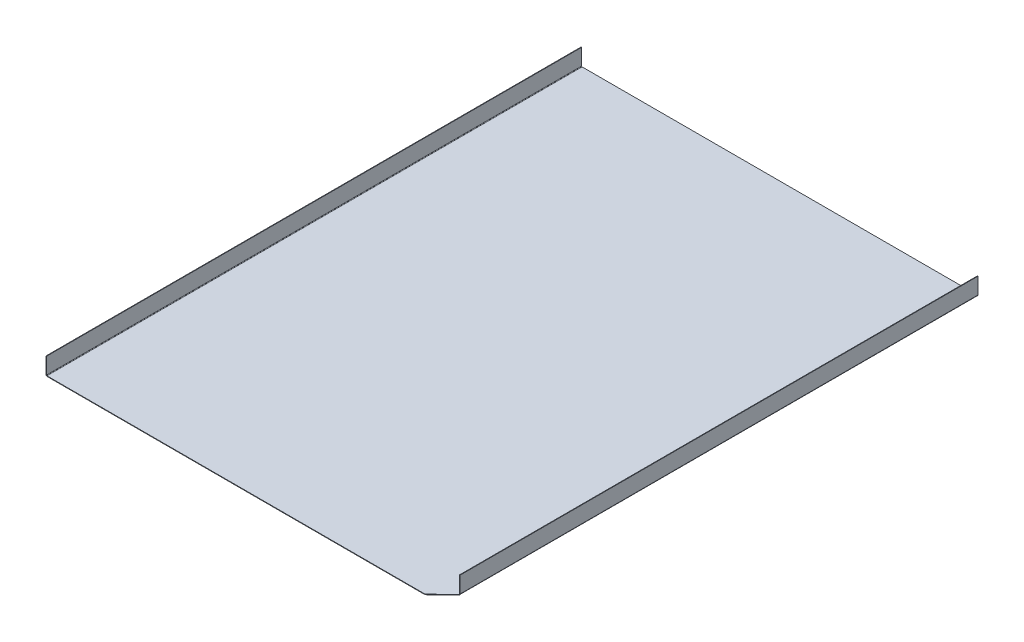
ISO-10303-21;
HEADER;
FILE_DESCRIPTION(('STEP AP214'),'2;1');
FILE_NAME('part.step','',(''),(''),'','','');
FILE_SCHEMA(('AUTOMOTIVE_DESIGN { 1 0 10303 214 1 1 1 1 }'));
ENDSEC;
DATA;
#1=APPLICATION_CONTEXT('core data for automotive mechanical design processes');
#2=APPLICATION_PROTOCOL_DEFINITION('international standard','automotive_design',2000,#1);
#3=PRODUCT_CONTEXT('',#1,'mechanical');
#4=PRODUCT('Part','Part','',(#3));
#5=PRODUCT_RELATED_PRODUCT_CATEGORY('part','',(#4));
#6=PRODUCT_DEFINITION_FORMATION('','',#4);
#7=PRODUCT_DEFINITION_CONTEXT('part definition',#1,'design');
#8=PRODUCT_DEFINITION('design','',#6,#7);
#9=PRODUCT_DEFINITION_SHAPE('','',#8);
#10=(LENGTH_UNIT() NAMED_UNIT(*) SI_UNIT(.MILLI.,.METRE.));
#11=(NAMED_UNIT(*) PLANE_ANGLE_UNIT() SI_UNIT($,.RADIAN.));
#12=(NAMED_UNIT(*) SI_UNIT($,.STERADIAN.) SOLID_ANGLE_UNIT());
#13=UNCERTAINTY_MEASURE_WITH_UNIT(LENGTH_MEASURE(1.E-05),#10,'distance_accuracy_value','');
#14=(GEOMETRIC_REPRESENTATION_CONTEXT(3) GLOBAL_UNCERTAINTY_ASSIGNED_CONTEXT((#13)) GLOBAL_UNIT_ASSIGNED_CONTEXT((#10,
#11,#12)) REPRESENTATION_CONTEXT('',''));
#15=CARTESIAN_POINT('',(0.,0.,0.));
#16=DIRECTION('',(0.,0.,1.));
#17=DIRECTION('',(1.,0.,0.));
#18=AXIS2_PLACEMENT_3D('',#15,#16,#17);
#19=CARTESIAN_POINT('',(471.3,0.,597.5));
#20=DIRECTION('',(0.,0.,-1.));
#21=DIRECTION('',(0.,1.,0.));
#22=AXIS2_PLACEMENT_3D('',#19,#20,#21);
#23=PLANE('',#22);
#24=DIRECTION('',(1.,0.,0.));
#25=VECTOR('',#24,1.);
#26=CARTESIAN_POINT('',(473.7,-1.2,597.5));
#27=LINE('',#26,#25);
#28=CARTESIAN_POINT('',(471.3,-1.2,597.5));
#29=VERTEX_POINT('',#28);
#30=CARTESIAN_POINT('',(473.7,-1.2,597.5));
#31=VERTEX_POINT('',#30);
#32=EDGE_CURVE('E300',#29,#31,#27,.T.);
#33=ORIENTED_EDGE('',*,*,#32,.F.);
#34=CARTESIAN_POINT('',(471.3,1.19999999999995,597.5));
#35=DIRECTION('',(0.,0.,-1.));
#36=DIRECTION('',(0.,1.,0.));
#37=AXIS2_PLACEMENT_3D('',#34,#35,#36);
#38=CIRCLE('',#37,2.39999999999987);
#39=CARTESIAN_POINT('',(473.378460969083,0.,597.5));
#40=VERTEX_POINT('',#39);
#41=EDGE_CURVE('E229',#29,#40,#38,.F.);
#42=ORIENTED_EDGE('',*,*,#41,.T.);
#43=DIRECTION('',(1.,0.,0.));
#44=VECTOR('',#43,1.);
#45=CARTESIAN_POINT('',(471.3,0.,597.5));
#46=LINE('',#45,#44);
#47=CARTESIAN_POINT('',(473.7,0.,597.5));
#48=VERTEX_POINT('',#47);
#49=EDGE_CURVE('E296',#40,#48,#46,.T.);
#50=ORIENTED_EDGE('',*,*,#49,.T.);
#51=DIRECTION('',(0.,1.,0.));
#52=VECTOR('',#51,1.);
#53=CARTESIAN_POINT('',(473.7,0.,597.5));
#54=LINE('',#53,#52);
#55=EDGE_CURVE('E308',#48,#31,#54,.F.);
#56=ORIENTED_EDGE('',*,*,#55,.T.);
#57=EDGE_LOOP('',(#33,#42,#50,#56));
#58=FACE_BOUND('',#57,.T.);
#59=ADVANCED_FACE('F74',(#58),#23,.T.);
#60=CARTESIAN_POINT('',(473.7,-1.2,-638.7));
#61=DIRECTION('',(0.,-1.,0.));
#62=DIRECTION('',(0.,0.,-1.));
#63=AXIS2_PLACEMENT_3D('',#60,#61,#62);
#64=PLANE('',#63);
#65=DIRECTION('',(-1.,0.,0.));
#66=VECTOR('',#65,1.);
#67=CARTESIAN_POINT('',(-473.7,-1.2,-638.7));
#68=LINE('',#67,#66);
#69=CARTESIAN_POINT('',(471.3,-1.2,-638.7));
#70=VERTEX_POINT('',#69);
#71=CARTESIAN_POINT('',(-471.3,-1.2,-638.7));
#72=VERTEX_POINT('',#71);
#73=EDGE_CURVE('E83',#70,#72,#68,.T.);
#74=ORIENTED_EDGE('',*,*,#73,.F.);
#75=DIRECTION('',(0.,0.,-1.));
#76=VECTOR('',#75,1.);
#77=CARTESIAN_POINT('',(471.3,-1.1999999999998,-638.7));
#78=LINE('',#77,#76);
#79=EDGE_CURVE('E91',#70,#29,#78,.F.);
#80=ORIENTED_EDGE('',*,*,#79,.T.);
#81=ORIENTED_EDGE('',*,*,#32,.T.);
#82=DIRECTION('',(0.717182759200081,0.,-0.696885133939703));
#83=VECTOR('',#82,1.);
#84=CARTESIAN_POINT('',(1091.54534676127,-1.2,-2.85915770199252));
#85=LINE('',#84,#83);
#86=CARTESIAN_POINT('',(431.3,-1.2,638.7));
#87=VERTEX_POINT('',#86);
#88=EDGE_CURVE('E303',#87,#31,#85,.T.);
#89=ORIENTED_EDGE('',*,*,#88,.F.);
#90=DIRECTION('',(1.,0.,0.));
#91=VECTOR('',#90,1.);
#92=CARTESIAN_POINT('',(-473.7,-1.2,638.7));
#93=LINE('',#92,#91);
#94=CARTESIAN_POINT('',(-471.3,-1.19999999999999,638.7));
#95=VERTEX_POINT('',#94);
#96=EDGE_CURVE('E13',#95,#87,#93,.T.);
#97=ORIENTED_EDGE('',*,*,#96,.F.);
#98=DIRECTION('',(0.,0.,1.));
#99=VECTOR('',#98,1.);
#100=CARTESIAN_POINT('',(-471.3,-1.19999999999999,638.7));
#101=LINE('',#100,#99);
#102=EDGE_CURVE('E276',#95,#72,#101,.F.);
#103=ORIENTED_EDGE('',*,*,#102,.T.);
#104=EDGE_LOOP('',(#74,#80,#81,#89,#97,#103));
#105=FACE_BOUND('',#104,.T.);
#106=ADVANCED_FACE('F330',(#105),#64,.T.);
#107=CARTESIAN_POINT('',(473.7,0.,-638.7));
#108=DIRECTION('',(0.,-1.,0.));
#109=DIRECTION('',(0.,0.,-1.));
#110=AXIS2_PLACEMENT_3D('',#107,#108,#109);
#111=PLANE('',#110);
#112=DIRECTION('',(0.,0.,-1.));
#113=VECTOR('',#112,1.);
#114=CARTESIAN_POINT('',(471.3,1.97975316695853E-13,-638.7));
#115=LINE('',#114,#113);
#116=CARTESIAN_POINT('',(471.3,0.,-638.7));
#117=VERTEX_POINT('',#116);
#118=CARTESIAN_POINT('',(471.3,0.,597.5));
#119=VERTEX_POINT('',#118);
#120=EDGE_CURVE('E238',#117,#119,#115,.F.);
#121=ORIENTED_EDGE('',*,*,#120,.F.);
#122=DIRECTION('',(-1.,0.,0.));
#123=VECTOR('',#122,1.);
#124=CARTESIAN_POINT('',(-473.7,0.,-638.7));
#125=LINE('',#124,#123);
#126=CARTESIAN_POINT('',(-471.3,0.,-638.7));
#127=VERTEX_POINT('',#126);
#128=EDGE_CURVE('E311',#117,#127,#125,.T.);
#129=ORIENTED_EDGE('',*,*,#128,.T.);
#130=DIRECTION('',(0.,0.,1.));
#131=VECTOR('',#130,1.);
#132=CARTESIAN_POINT('',(-471.3,0.,638.7));
#133=LINE('',#132,#131);
#134=CARTESIAN_POINT('',(-471.3,0.,638.7));
#135=VERTEX_POINT('',#134);
#136=EDGE_CURVE('E289',#135,#127,#133,.F.);
#137=ORIENTED_EDGE('',*,*,#136,.F.);
#138=DIRECTION('',(1.,0.,0.));
#139=VECTOR('',#138,1.);
#140=CARTESIAN_POINT('',(-473.7,0.,638.7));
#141=LINE('',#140,#139);
#142=CARTESIAN_POINT('',(431.3,0.,638.7));
#143=VERTEX_POINT('',#142);
#144=EDGE_CURVE('E78',#135,#143,#141,.T.);
#145=ORIENTED_EDGE('',*,*,#144,.T.);
#146=DIRECTION('',(0.717182759200081,0.,-0.696885133939703));
#147=VECTOR('',#146,1.);
#148=CARTESIAN_POINT('',(1091.54534676127,0.,-2.85915770199252));
#149=LINE('',#148,#147);
#150=EDGE_CURVE('E302',#143,#48,#149,.T.);
#151=ORIENTED_EDGE('',*,*,#150,.T.);
#152=ORIENTED_EDGE('',*,*,#49,.F.);
#153=EDGE_CURVE('E99',#119,#40,#46,.T.);
#154=ORIENTED_EDGE('',*,*,#153,.F.);
#155=EDGE_LOOP('',(#121,#129,#137,#145,#151,#152,#154));
#156=FACE_BOUND('',#155,.T.);
#157=ADVANCED_FACE('F321',(#156),#111,.F.);
#158=CARTESIAN_POINT('',(-473.7,-1.2,-638.7));
#159=DIRECTION('',(0.,0.,-1.));
#160=DIRECTION('',(-1.,0.,0.));
#161=AXIS2_PLACEMENT_3D('',#158,#159,#160);
#162=PLANE('',#161);
#163=ORIENTED_EDGE('',*,*,#128,.F.);
#164=DIRECTION('',(0.,-1.,0.));
#165=VECTOR('',#164,1.);
#166=CARTESIAN_POINT('',(471.3,1.97975316695853E-13,-638.7));
#167=LINE('',#166,#165);
#168=EDGE_CURVE('E232',#117,#70,#167,.T.);
#169=ORIENTED_EDGE('',*,*,#168,.T.);
#170=ORIENTED_EDGE('',*,*,#73,.T.);
#171=DIRECTION('',(0.,-1.,0.));
#172=VECTOR('',#171,1.);
#173=CARTESIAN_POINT('',(-471.3,0.,-638.7));
#174=LINE('',#173,#172);
#175=EDGE_CURVE('E293',#127,#72,#174,.T.);
#176=ORIENTED_EDGE('',*,*,#175,.F.);
#177=EDGE_LOOP('',(#163,#169,#170,#176));
#178=FACE_BOUND('',#177,.T.);
#179=ADVANCED_FACE('F76',(#178),#162,.T.);
#180=CARTESIAN_POINT('',(-473.7,-1.2,638.7));
#181=DIRECTION('',(0.,0.,1.));
#182=DIRECTION('',(1.,0.,0.));
#183=AXIS2_PLACEMENT_3D('',#180,#181,#182);
#184=PLANE('',#183);
#185=ORIENTED_EDGE('',*,*,#144,.F.);
#186=DIRECTION('',(0.,-1.,0.));
#187=VECTOR('',#186,1.);
#188=CARTESIAN_POINT('',(-471.3,0.,638.7));
#189=LINE('',#188,#187);
#190=EDGE_CURVE('E283',#135,#95,#189,.T.);
#191=ORIENTED_EDGE('',*,*,#190,.T.);
#192=ORIENTED_EDGE('',*,*,#96,.T.);
#193=DIRECTION('',(0.,1.,0.));
#194=VECTOR('',#193,1.);
#195=CARTESIAN_POINT('',(431.3,0.,638.7));
#196=LINE('',#195,#194);
#197=EDGE_CURVE('E305',#143,#87,#196,.F.);
#198=ORIENTED_EDGE('',*,*,#197,.F.);
#199=EDGE_LOOP('',(#185,#191,#192,#198));
#200=FACE_BOUND('',#199,.T.);
#201=ADVANCED_FACE('F328',(#200),#184,.T.);
#202=CARTESIAN_POINT('',(1091.54534676127,0.,-2.85915770199252));
#203=DIRECTION('',(-0.696885133939703,0.,-0.717182759200081));
#204=DIRECTION('',(0.717182759200081,0.,-0.696885133939703));
#205=AXIS2_PLACEMENT_3D('',#202,#203,#204);
#206=PLANE('',#205);
#207=ORIENTED_EDGE('',*,*,#55,.F.);
#208=ORIENTED_EDGE('',*,*,#150,.F.);
#209=ORIENTED_EDGE('',*,*,#197,.T.);
#210=ORIENTED_EDGE('',*,*,#88,.T.);
#211=EDGE_LOOP('',(#207,#208,#209,#210));
#212=FACE_BOUND('',#211,.T.);
#213=ADVANCED_FACE('F326',(#212),#206,.F.);
#214=CARTESIAN_POINT('',(-471.3,1.19999999999998,-638.7));
#215=DIRECTION('',(0.,0.,-1.));
#216=DIRECTION('',(-1.,0.,0.));
#217=AXIS2_PLACEMENT_3D('',#214,#215,#216);
#218=PLANE('',#217);
#219=DIRECTION('',(-1.,0.,0.));
#220=VECTOR('',#219,1.);
#221=CARTESIAN_POINT('',(-473.7,1.19999999999997,-638.7));
#222=LINE('',#221,#220);
#223=CARTESIAN_POINT('',(-472.5,1.19999999999998,-638.7));
#224=VERTEX_POINT('',#223);
#225=CARTESIAN_POINT('',(-473.7,1.19999999999997,-638.7));
#226=VERTEX_POINT('',#225);
#227=EDGE_CURVE('E243',#224,#226,#222,.T.);
#228=ORIENTED_EDGE('',*,*,#227,.F.);
#229=CARTESIAN_POINT('',(-471.3,1.19999999999998,-638.7));
#230=DIRECTION('',(0.,0.,1.));
#231=DIRECTION('',(1.,0.,0.));
#232=AXIS2_PLACEMENT_3D('',#229,#230,#231);
#233=CIRCLE('',#232,1.19999999999998);
#234=EDGE_CURVE('E286',#127,#224,#233,.F.);
#235=ORIENTED_EDGE('',*,*,#234,.F.);
#236=ORIENTED_EDGE('',*,*,#175,.T.);
#237=CARTESIAN_POINT('',(-471.3,1.19999999999998,-638.7));
#238=DIRECTION('',(0.,0.,1.));
#239=DIRECTION('',(1.,0.,0.));
#240=AXIS2_PLACEMENT_3D('',#237,#238,#239);
#241=CIRCLE('',#240,2.39999999999998);
#242=EDGE_CURVE('E279',#72,#226,#241,.F.);
#243=ORIENTED_EDGE('',*,*,#242,.T.);
#244=EDGE_LOOP('',(#228,#235,#236,#243));
#245=FACE_BOUND('',#244,.T.);
#246=ADVANCED_FACE('F368',(#245),#218,.T.);
#247=CARTESIAN_POINT('',(-471.3,1.19999999999998,638.7));
#248=DIRECTION('',(0.,0.,-1.));
#249=DIRECTION('',(-1.,0.,0.));
#250=AXIS2_PLACEMENT_3D('',#247,#248,#249);
#251=PLANE('',#250);
#252=CARTESIAN_POINT('',(-471.3,1.19999999999998,638.7));
#253=DIRECTION('',(0.,0.,1.));
#254=DIRECTION('',(1.,0.,0.));
#255=AXIS2_PLACEMENT_3D('',#252,#253,#254);
#256=CIRCLE('',#255,1.19999999999998);
#257=CARTESIAN_POINT('',(-472.5,1.19999999999998,638.7));
#258=VERTEX_POINT('',#257);
#259=EDGE_CURVE('E246',#258,#135,#256,.T.);
#260=ORIENTED_EDGE('',*,*,#259,.F.);
#261=DIRECTION('',(-1.,0.,0.));
#262=VECTOR('',#261,1.);
#263=CARTESIAN_POINT('',(-472.5,1.19999999999998,638.7));
#264=LINE('',#263,#262);
#265=CARTESIAN_POINT('',(-473.7,1.19999999999997,638.7));
#266=VERTEX_POINT('',#265);
#267=EDGE_CURVE('E269',#258,#266,#264,.T.);
#268=ORIENTED_EDGE('',*,*,#267,.T.);
#269=CARTESIAN_POINT('',(-471.3,1.19999999999998,638.7));
#270=DIRECTION('',(0.,0.,1.));
#271=DIRECTION('',(1.,0.,0.));
#272=AXIS2_PLACEMENT_3D('',#269,#270,#271);
#273=CIRCLE('',#272,2.39999999999998);
#274=EDGE_CURVE('E280',#266,#95,#273,.T.);
#275=ORIENTED_EDGE('',*,*,#274,.T.);
#276=ORIENTED_EDGE('',*,*,#190,.F.);
#277=EDGE_LOOP('',(#260,#268,#275,#276));
#278=FACE_BOUND('',#277,.T.);
#279=ADVANCED_FACE('F365',(#278),#251,.F.);
#280=CARTESIAN_POINT('',(-471.3,1.19999999999998,638.7));
#281=DIRECTION('',(0.,0.,1.));
#282=DIRECTION('',(-1.,0.,0.));
#283=AXIS2_PLACEMENT_3D('',#280,#281,#282);
#284=CYLINDRICAL_SURFACE('',#283,2.39999999999998);
#285=ORIENTED_EDGE('',*,*,#102,.F.);
#286=ORIENTED_EDGE('',*,*,#274,.F.);
#287=DIRECTION('',(0.,0.,1.));
#288=VECTOR('',#287,1.);
#289=CARTESIAN_POINT('',(-473.7,1.19999999999997,638.7));
#290=LINE('',#289,#288);
#291=EDGE_CURVE('E266',#226,#266,#290,.T.);
#292=ORIENTED_EDGE('',*,*,#291,.F.);
#293=ORIENTED_EDGE('',*,*,#242,.F.);
#294=EDGE_LOOP('',(#285,#286,#292,#293));
#295=FACE_BOUND('',#294,.T.);
#296=ADVANCED_FACE('F518',(#295),#284,.T.);
#297=CARTESIAN_POINT('',(-471.3,1.19999999999998,638.7));
#298=DIRECTION('',(0.,0.,1.));
#299=DIRECTION('',(-1.,0.,0.));
#300=AXIS2_PLACEMENT_3D('',#297,#298,#299);
#301=CYLINDRICAL_SURFACE('',#300,1.19999999999998);
#302=ORIENTED_EDGE('',*,*,#136,.T.);
#303=ORIENTED_EDGE('',*,*,#234,.T.);
#304=DIRECTION('',(0.,0.,-1.));
#305=VECTOR('',#304,1.);
#306=CARTESIAN_POINT('',(-472.5,1.19999999999998,-638.7));
#307=LINE('',#306,#305);
#308=EDGE_CURVE('E272',#224,#258,#307,.F.);
#309=ORIENTED_EDGE('',*,*,#308,.T.);
#310=ORIENTED_EDGE('',*,*,#259,.T.);
#311=EDGE_LOOP('',(#302,#303,#309,#310));
#312=FACE_BOUND('',#311,.T.);
#313=ADVANCED_FACE('F508',(#312),#301,.F.);
#314=CARTESIAN_POINT('',(-473.7,0.,638.7));
#315=DIRECTION('',(0.,0.,1.));
#316=DIRECTION('',(1.,0.,0.));
#317=AXIS2_PLACEMENT_3D('',#314,#315,#316);
#318=PLANE('',#317);
#319=DIRECTION('',(0.,-1.,0.));
#320=VECTOR('',#319,1.);
#321=CARTESIAN_POINT('',(-473.7,0.,638.7));
#322=LINE('',#321,#320);
#323=CARTESIAN_POINT('',(-473.7,40.,638.7));
#324=VERTEX_POINT('',#323);
#325=EDGE_CURVE('E250',#324,#266,#322,.T.);
#326=ORIENTED_EDGE('',*,*,#325,.T.);
#327=ORIENTED_EDGE('',*,*,#267,.F.);
#328=DIRECTION('',(0.,1.,0.));
#329=VECTOR('',#328,1.);
#330=CARTESIAN_POINT('',(-472.5,0.,638.7));
#331=LINE('',#330,#329);
#332=CARTESIAN_POINT('',(-472.5,40.,638.7));
#333=VERTEX_POINT('',#332);
#334=EDGE_CURVE('E258',#333,#258,#331,.F.);
#335=ORIENTED_EDGE('',*,*,#334,.F.);
#336=DIRECTION('',(1.,0.,0.));
#337=VECTOR('',#336,1.);
#338=CARTESIAN_POINT('',(-473.7,40.,638.7));
#339=LINE('',#338,#337);
#340=EDGE_CURVE('E244',#324,#333,#339,.T.);
#341=ORIENTED_EDGE('',*,*,#340,.F.);
#342=EDGE_LOOP('',(#326,#327,#335,#341));
#343=FACE_BOUND('',#342,.T.);
#344=ADVANCED_FACE('F498',(#343),#318,.T.);
#345=CARTESIAN_POINT('',(-473.7,40.,-638.7));
#346=DIRECTION('',(0.,0.,-1.));
#347=DIRECTION('',(-1.,0.,0.));
#348=AXIS2_PLACEMENT_3D('',#345,#346,#347);
#349=PLANE('',#348);
#350=DIRECTION('',(0.,-1.,0.));
#351=VECTOR('',#350,1.);
#352=CARTESIAN_POINT('',(-472.5,0.,-638.7));
#353=LINE('',#352,#351);
#354=CARTESIAN_POINT('',(-472.5,40.,-638.7));
#355=VERTEX_POINT('',#354);
#356=EDGE_CURVE('E264',#224,#355,#353,.F.);
#357=ORIENTED_EDGE('',*,*,#356,.F.);
#358=ORIENTED_EDGE('',*,*,#227,.T.);
#359=DIRECTION('',(0.,1.,0.));
#360=VECTOR('',#359,1.);
#361=CARTESIAN_POINT('',(-473.7,40.,-638.7));
#362=LINE('',#361,#360);
#363=CARTESIAN_POINT('',(-473.7,40.,-638.7));
#364=VERTEX_POINT('',#363);
#365=EDGE_CURVE('E256',#226,#364,#362,.T.);
#366=ORIENTED_EDGE('',*,*,#365,.T.);
#367=DIRECTION('',(1.,0.,0.));
#368=VECTOR('',#367,1.);
#369=CARTESIAN_POINT('',(-473.7,40.,-638.7));
#370=LINE('',#369,#368);
#371=EDGE_CURVE('E247',#364,#355,#370,.T.);
#372=ORIENTED_EDGE('',*,*,#371,.T.);
#373=EDGE_LOOP('',(#357,#358,#366,#372));
#374=FACE_BOUND('',#373,.T.);
#375=ADVANCED_FACE('F489',(#374),#349,.T.);
#376=CARTESIAN_POINT('',(-473.7,0.,638.7));
#377=DIRECTION('',(-1.,0.,0.));
#378=DIRECTION('',(0.,-1.,0.));
#379=AXIS2_PLACEMENT_3D('',#376,#377,#378);
#380=PLANE('',#379);
#381=ORIENTED_EDGE('',*,*,#365,.F.);
#382=ORIENTED_EDGE('',*,*,#291,.T.);
#383=ORIENTED_EDGE('',*,*,#325,.F.);
#384=DIRECTION('',(0.,0.,1.));
#385=VECTOR('',#384,1.);
#386=CARTESIAN_POINT('',(-473.7,40.,638.7));
#387=LINE('',#386,#385);
#388=EDGE_CURVE('E253',#364,#324,#387,.T.);
#389=ORIENTED_EDGE('',*,*,#388,.F.);
#390=EDGE_LOOP('',(#381,#382,#383,#389));
#391=FACE_BOUND('',#390,.T.);
#392=ADVANCED_FACE('F479',(#391),#380,.T.);
#393=CARTESIAN_POINT('',(-472.5,0.,638.7));
#394=DIRECTION('',(-1.,0.,0.));
#395=DIRECTION('',(0.,-1.,0.));
#396=AXIS2_PLACEMENT_3D('',#393,#394,#395);
#397=PLANE('',#396);
#398=ORIENTED_EDGE('',*,*,#308,.F.);
#399=ORIENTED_EDGE('',*,*,#356,.T.);
#400=DIRECTION('',(0.,0.,-1.));
#401=VECTOR('',#400,1.);
#402=CARTESIAN_POINT('',(-472.5,40.,638.7));
#403=LINE('',#402,#401);
#404=EDGE_CURVE('E261',#355,#333,#403,.F.);
#405=ORIENTED_EDGE('',*,*,#404,.T.);
#406=ORIENTED_EDGE('',*,*,#334,.T.);
#407=EDGE_LOOP('',(#398,#399,#405,#406));
#408=FACE_BOUND('',#407,.T.);
#409=ADVANCED_FACE('F469',(#408),#397,.F.);
#410=CARTESIAN_POINT('',(-473.7,40.,638.7));
#411=DIRECTION('',(0.,1.,0.));
#412=DIRECTION('',(-1.,0.,0.));
#413=AXIS2_PLACEMENT_3D('',#410,#411,#412);
#414=PLANE('',#413);
#415=ORIENTED_EDGE('',*,*,#404,.F.);
#416=ORIENTED_EDGE('',*,*,#371,.F.);
#417=ORIENTED_EDGE('',*,*,#388,.T.);
#418=ORIENTED_EDGE('',*,*,#340,.T.);
#419=EDGE_LOOP('',(#415,#416,#417,#418));
#420=FACE_BOUND('',#419,.T.);
#421=ADVANCED_FACE('F388',(#420),#414,.T.);
#422=CARTESIAN_POINT('',(471.3,1.19999999999995,597.5));
#423=DIRECTION('',(0.,0.,1.));
#424=DIRECTION('',(0.,-1.,0.));
#425=AXIS2_PLACEMENT_3D('',#422,#423,#424);
#426=PLANE('',#425);
#427=CARTESIAN_POINT('',(471.3,1.19999999999995,597.5));
#428=DIRECTION('',(0.,0.,-1.));
#429=DIRECTION('',(0.,1.,0.));
#430=AXIS2_PLACEMENT_3D('',#427,#428,#429);
#431=CIRCLE('',#430,1.19999999999987);
#432=CARTESIAN_POINT('',(472.5,1.19999999999995,597.5));
#433=VERTEX_POINT('',#432);
#434=EDGE_CURVE('E235',#119,#433,#431,.F.);
#435=ORIENTED_EDGE('',*,*,#434,.F.);
#436=ORIENTED_EDGE('',*,*,#153,.T.);
#437=CARTESIAN_POINT('',(473.7,1.19999999999995,597.5));
#438=VERTEX_POINT('',#437);
#439=EDGE_CURVE('E227',#40,#438,#38,.F.);
#440=ORIENTED_EDGE('',*,*,#439,.T.);
#441=DIRECTION('',(1.,0.,0.));
#442=VECTOR('',#441,1.);
#443=CARTESIAN_POINT('',(473.7,1.19999999999998,597.5));
#444=LINE('',#443,#442);
#445=EDGE_CURVE('E223',#433,#438,#444,.T.);
#446=ORIENTED_EDGE('',*,*,#445,.F.);
#447=EDGE_LOOP('',(#435,#436,#440,#446));
#448=FACE_BOUND('',#447,.T.);
#449=ADVANCED_FACE('F337',(#448),#426,.T.);
#450=CARTESIAN_POINT('',(471.3,1.20000000000007,-638.7));
#451=DIRECTION('',(0.,0.,1.));
#452=DIRECTION('',(0.,-1.,0.));
#453=AXIS2_PLACEMENT_3D('',#450,#451,#452);
#454=PLANE('',#453);
#455=CARTESIAN_POINT('',(471.3,1.20000000000007,-638.7));
#456=DIRECTION('',(0.,0.,-1.));
#457=DIRECTION('',(0.,1.,0.));
#458=AXIS2_PLACEMENT_3D('',#455,#456,#457);
#459=CIRCLE('',#458,1.19999999999987);
#460=CARTESIAN_POINT('',(472.5,1.20000000000006,-638.7));
#461=VERTEX_POINT('',#460);
#462=EDGE_CURVE('E192',#461,#117,#459,.T.);
#463=ORIENTED_EDGE('',*,*,#462,.F.);
#464=DIRECTION('',(1.,0.,0.));
#465=VECTOR('',#464,1.);
#466=CARTESIAN_POINT('',(472.5,1.20000000000003,-638.7));
#467=LINE('',#466,#465);
#468=CARTESIAN_POINT('',(473.7,1.20000000000003,-638.7));
#469=VERTEX_POINT('',#468);
#470=EDGE_CURVE('E218',#461,#469,#467,.T.);
#471=ORIENTED_EDGE('',*,*,#470,.T.);
#472=CARTESIAN_POINT('',(471.3,1.20000000000007,-638.7));
#473=DIRECTION('',(0.,0.,-1.));
#474=DIRECTION('',(0.,1.,0.));
#475=AXIS2_PLACEMENT_3D('',#472,#473,#474);
#476=CIRCLE('',#475,2.39999999999987);
#477=EDGE_CURVE('E228',#469,#70,#476,.T.);
#478=ORIENTED_EDGE('',*,*,#477,.T.);
#479=ORIENTED_EDGE('',*,*,#168,.F.);
#480=EDGE_LOOP('',(#463,#471,#478,#479));
#481=FACE_BOUND('',#480,.T.);
#482=ADVANCED_FACE('F380',(#481),#454,.F.);
#483=CARTESIAN_POINT('',(471.3,1.20000000000007,-638.7));
#484=DIRECTION('',(0.,0.,-1.));
#485=DIRECTION('',(1.,0.,0.));
#486=AXIS2_PLACEMENT_3D('',#483,#484,#485);
#487=CYLINDRICAL_SURFACE('',#486,2.39999999999987);
#488=ORIENTED_EDGE('',*,*,#79,.F.);
#489=ORIENTED_EDGE('',*,*,#477,.F.);
#490=DIRECTION('',(0.,0.,-1.));
#491=VECTOR('',#490,1.);
#492=CARTESIAN_POINT('',(473.7,1.19999999999998,597.5));
#493=LINE('',#492,#491);
#494=EDGE_CURVE('E202',#469,#438,#493,.F.);
#495=ORIENTED_EDGE('',*,*,#494,.T.);
#496=ORIENTED_EDGE('',*,*,#439,.F.);
#497=ORIENTED_EDGE('',*,*,#41,.F.);
#498=EDGE_LOOP('',(#488,#489,#495,#496,#497));
#499=FACE_BOUND('',#498,.T.);
#500=ADVANCED_FACE('F338',(#499),#487,.T.);
#501=CARTESIAN_POINT('',(471.3,1.20000000000007,-638.7));
#502=DIRECTION('',(0.,0.,-1.));
#503=DIRECTION('',(1.,0.,0.));
#504=AXIS2_PLACEMENT_3D('',#501,#502,#503);
#505=CYLINDRICAL_SURFACE('',#504,1.19999999999987);
#506=ORIENTED_EDGE('',*,*,#120,.T.);
#507=ORIENTED_EDGE('',*,*,#434,.T.);
#508=DIRECTION('',(0.,0.,-1.));
#509=VECTOR('',#508,1.);
#510=CARTESIAN_POINT('',(472.5,1.19999999999998,597.5));
#511=LINE('',#510,#509);
#512=EDGE_CURVE('E221',#433,#461,#511,.T.);
#513=ORIENTED_EDGE('',*,*,#512,.T.);
#514=ORIENTED_EDGE('',*,*,#462,.T.);
#515=EDGE_LOOP('',(#506,#507,#513,#514));
#516=FACE_BOUND('',#515,.T.);
#517=ADVANCED_FACE('F344',(#516),#505,.F.);
#518=CARTESIAN_POINT('',(473.7,0.,597.5));
#519=DIRECTION('',(0.,0.,1.));
#520=DIRECTION('',(0.,-1.,0.));
#521=AXIS2_PLACEMENT_3D('',#518,#519,#520);
#522=PLANE('',#521);
#523=DIRECTION('',(0.,1.,0.));
#524=VECTOR('',#523,1.);
#525=CARTESIAN_POINT('',(472.5,40.,597.500000000001));
#526=LINE('',#525,#524);
#527=CARTESIAN_POINT('',(472.5,40.,597.500000000001));
#528=VERTEX_POINT('',#527);
#529=EDGE_CURVE('E215',#433,#528,#526,.T.);
#530=ORIENTED_EDGE('',*,*,#529,.F.);
#531=ORIENTED_EDGE('',*,*,#445,.T.);
#532=DIRECTION('',(0.,-1.,0.));
#533=VECTOR('',#532,1.);
#534=CARTESIAN_POINT('',(473.7,0.,597.5));
#535=LINE('',#534,#533);
#536=CARTESIAN_POINT('',(473.7,40.,597.500000000001));
#537=VERTEX_POINT('',#536);
#538=EDGE_CURVE('E207',#438,#537,#535,.F.);
#539=ORIENTED_EDGE('',*,*,#538,.T.);
#540=DIRECTION('',(-1.,0.,0.));
#541=VECTOR('',#540,1.);
#542=CARTESIAN_POINT('',(473.7,40.,597.500000000001));
#543=LINE('',#542,#541);
#544=EDGE_CURVE('E193',#537,#528,#543,.T.);
#545=ORIENTED_EDGE('',*,*,#544,.T.);
#546=EDGE_LOOP('',(#530,#531,#539,#545));
#547=FACE_BOUND('',#546,.T.);
#548=ADVANCED_FACE('F341',(#547),#522,.T.);
#549=CARTESIAN_POINT('',(473.7,40.,-638.7));
#550=DIRECTION('',(0.,0.,-1.));
#551=DIRECTION('',(0.,1.,0.));
#552=AXIS2_PLACEMENT_3D('',#549,#550,#551);
#553=PLANE('',#552);
#554=DIRECTION('',(0.,1.,0.));
#555=VECTOR('',#554,1.);
#556=CARTESIAN_POINT('',(473.7,40.,-638.7));
#557=LINE('',#556,#555);
#558=CARTESIAN_POINT('',(473.7,40.,-638.7));
#559=VERTEX_POINT('',#558);
#560=EDGE_CURVE('E185',#559,#469,#557,.F.);
#561=ORIENTED_EDGE('',*,*,#560,.T.);
#562=ORIENTED_EDGE('',*,*,#470,.F.);
#563=DIRECTION('',(0.,-1.,0.));
#564=VECTOR('',#563,1.);
#565=CARTESIAN_POINT('',(472.5,40.0000000000034,-638.7));
#566=LINE('',#565,#564);
#567=CARTESIAN_POINT('',(472.5,40.,-638.7));
#568=VERTEX_POINT('',#567);
#569=EDGE_CURVE('E187',#568,#461,#566,.T.);
#570=ORIENTED_EDGE('',*,*,#569,.F.);
#571=DIRECTION('',(-1.,0.,0.));
#572=VECTOR('',#571,1.);
#573=CARTESIAN_POINT('',(473.7,40.,-638.7));
#574=LINE('',#573,#572);
#575=EDGE_CURVE('E181',#559,#568,#574,.T.);
#576=ORIENTED_EDGE('',*,*,#575,.F.);
#577=EDGE_LOOP('',(#561,#562,#570,#576));
#578=FACE_BOUND('',#577,.T.);
#579=ADVANCED_FACE('F183',(#578),#553,.T.);
#580=CARTESIAN_POINT('',(473.7,40.,597.500000000001));
#581=DIRECTION('',(-1.,0.,0.));
#582=DIRECTION('',(0.,-1.,0.));
#583=AXIS2_PLACEMENT_3D('',#580,#581,#582);
#584=PLANE('',#583);
#585=ORIENTED_EDGE('',*,*,#494,.F.);
#586=ORIENTED_EDGE('',*,*,#560,.F.);
#587=DIRECTION('',(0.,0.,1.));
#588=VECTOR('',#587,1.);
#589=CARTESIAN_POINT('',(473.7,40.,597.500000000001));
#590=LINE('',#589,#588);
#591=EDGE_CURVE('E200',#537,#559,#590,.F.);
#592=ORIENTED_EDGE('',*,*,#591,.F.);
#593=ORIENTED_EDGE('',*,*,#538,.F.);
#594=EDGE_LOOP('',(#585,#586,#592,#593));
#595=FACE_BOUND('',#594,.T.);
#596=ADVANCED_FACE('F198',(#595),#584,.F.);
#597=CARTESIAN_POINT('',(472.5,40.,597.500000000001));
#598=DIRECTION('',(-1.,0.,0.));
#599=DIRECTION('',(0.,-1.,0.));
#600=AXIS2_PLACEMENT_3D('',#597,#598,#599);
#601=PLANE('',#600);
#602=ORIENTED_EDGE('',*,*,#569,.T.);
#603=ORIENTED_EDGE('',*,*,#512,.F.);
#604=ORIENTED_EDGE('',*,*,#529,.T.);
#605=DIRECTION('',(0.,0.,-1.));
#606=VECTOR('',#605,1.);
#607=CARTESIAN_POINT('',(472.5,40.,597.500000000001));
#608=LINE('',#607,#606);
#609=EDGE_CURVE('E213',#528,#568,#608,.T.);
#610=ORIENTED_EDGE('',*,*,#609,.T.);
#611=EDGE_LOOP('',(#602,#603,#604,#610));
#612=FACE_BOUND('',#611,.T.);
#613=ADVANCED_FACE('F347',(#612),#601,.T.);
#614=CARTESIAN_POINT('',(473.7,40.,597.500000000001));
#615=DIRECTION('',(0.,1.,0.));
#616=DIRECTION('',(-1.,0.,0.));
#617=AXIS2_PLACEMENT_3D('',#614,#615,#616);
#618=PLANE('',#617);
#619=ORIENTED_EDGE('',*,*,#609,.F.);
#620=ORIENTED_EDGE('',*,*,#544,.F.);
#621=ORIENTED_EDGE('',*,*,#591,.T.);
#622=ORIENTED_EDGE('',*,*,#575,.T.);
#623=EDGE_LOOP('',(#619,#620,#621,#622));
#624=FACE_BOUND('',#623,.T.);
#625=ADVANCED_FACE('F205',(#624),#618,.T.);
#626=CLOSED_SHELL('',(#59,#106,#157,#179,#201,#213,#246,#279,#296,#313,#344,#375,#392,#409,#421,
#449,#482,#500,#517,#548,#579,#596,#613,#625));
#627=MANIFOLD_SOLID_BREP('B2',#626);
#628=ADVANCED_BREP_SHAPE_REPRESENTATION('',(#18,#627),#14);
#629=SHAPE_DEFINITION_REPRESENTATION(#9,#628);
ENDSEC;
END-ISO-10303-21;
